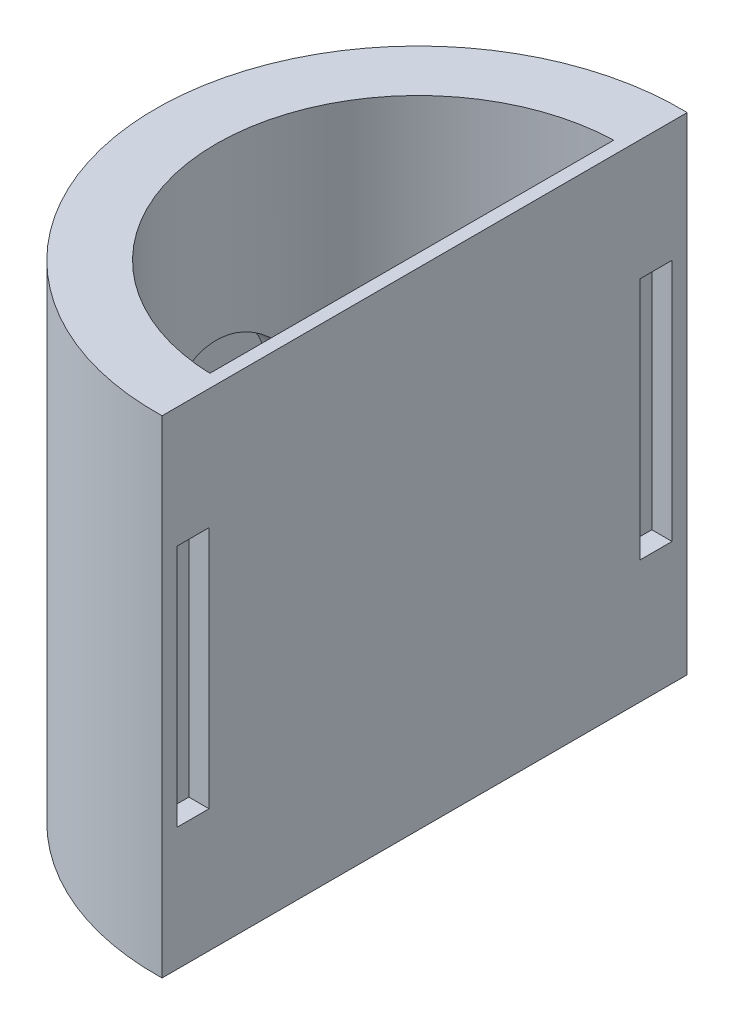
ISO-10303-21;
HEADER;
FILE_DESCRIPTION(('STEP AP214'),'2;1');
FILE_NAME('part.step','',(''),(''),'','','');
FILE_SCHEMA(('AUTOMOTIVE_DESIGN { 1 0 10303 214 1 1 1 1 }'));
ENDSEC;
DATA;
#1=APPLICATION_CONTEXT('core data for automotive mechanical design processes');
#2=APPLICATION_PROTOCOL_DEFINITION('international standard','automotive_design',2000,#1);
#3=PRODUCT_CONTEXT('',#1,'mechanical');
#4=PRODUCT('Part','Part','',(#3));
#5=PRODUCT_RELATED_PRODUCT_CATEGORY('part','',(#4));
#6=PRODUCT_DEFINITION_FORMATION('','',#4);
#7=PRODUCT_DEFINITION_CONTEXT('part definition',#1,'design');
#8=PRODUCT_DEFINITION('design','',#6,#7);
#9=PRODUCT_DEFINITION_SHAPE('','',#8);
#10=(LENGTH_UNIT() NAMED_UNIT(*) SI_UNIT(.MILLI.,.METRE.));
#11=(NAMED_UNIT(*) PLANE_ANGLE_UNIT() SI_UNIT($,.RADIAN.));
#12=(NAMED_UNIT(*) SI_UNIT($,.STERADIAN.) SOLID_ANGLE_UNIT());
#13=UNCERTAINTY_MEASURE_WITH_UNIT(LENGTH_MEASURE(1.E-05),#10,'distance_accuracy_value','');
#14=(GEOMETRIC_REPRESENTATION_CONTEXT(3) GLOBAL_UNCERTAINTY_ASSIGNED_CONTEXT((#13)) GLOBAL_UNIT_ASSIGNED_CONTEXT((#10,
#11,#12)) REPRESENTATION_CONTEXT('',''));
#15=CARTESIAN_POINT('',(0.,0.,0.));
#16=DIRECTION('',(0.,0.,1.));
#17=DIRECTION('',(1.,0.,0.));
#18=AXIS2_PLACEMENT_3D('',#15,#16,#17);
#19=CARTESIAN_POINT('',(3.175,0.,0.));
#20=DIRECTION('',(1.,0.,0.));
#21=DIRECTION('',(0.,0.,-1.));
#22=AXIS2_PLACEMENT_3D('',#19,#20,#21);
#23=PLANE('',#22);
#24=DIRECTION('',(0.,-1.,0.));
#25=VECTOR('',#24,1.);
#26=CARTESIAN_POINT('',(3.175,181.421684221425,122.458312978031));
#27=LINE('',#26,#25);
#28=CARTESIAN_POINT('',(3.175,181.421684221425,122.458312978031));
#29=VERTEX_POINT('',#28);
#30=CARTESIAN_POINT('',(3.175,60.9166842214253,122.458312978031));
#31=VERTEX_POINT('',#30);
#32=EDGE_CURVE('E78',#29,#31,#27,.T.);
#33=ORIENTED_EDGE('',*,*,#32,.F.);
#34=DIRECTION('',(0.,0.,1.));
#35=VECTOR('',#34,1.);
#36=CARTESIAN_POINT('',(3.175,181.421684221425,122.458312978031));
#37=LINE('',#36,#35);
#38=CARTESIAN_POINT('',(3.175,181.421684221425,106.709366457998));
#39=VERTEX_POINT('',#38);
#40=EDGE_CURVE('E199',#39,#29,#37,.T.);
#41=ORIENTED_EDGE('',*,*,#40,.F.);
#42=DIRECTION('',(0.,1.,0.));
#43=VECTOR('',#42,1.);
#44=CARTESIAN_POINT('',(3.175,181.421684221425,106.709366457998));
#45=LINE('',#44,#43);
#46=CARTESIAN_POINT('',(3.175,60.9166842214253,106.709366457998));
#47=VERTEX_POINT('',#46);
#48=EDGE_CURVE('E218',#47,#39,#45,.T.);
#49=ORIENTED_EDGE('',*,*,#48,.F.);
#50=DIRECTION('',(0.,0.,-1.));
#51=VECTOR('',#50,1.);
#52=CARTESIAN_POINT('',(3.175,60.9166842214253,122.458312978031));
#53=LINE('',#52,#51);
#54=EDGE_CURVE('E214',#31,#47,#53,.T.);
#55=ORIENTED_EDGE('',*,*,#54,.F.);
#56=EDGE_LOOP('',(#33,#41,#49,#55));
#57=FACE_BOUND('',#56,.T.);
#58=DIRECTION('',(0.,0.,-1.));
#59=VECTOR('',#58,1.);
#60=CARTESIAN_POINT('',(3.175,0.,0.));
#61=LINE('',#60,#59);
#62=CARTESIAN_POINT('',(3.175,0.,129.961222581969));
#63=VERTEX_POINT('',#62);
#64=CARTESIAN_POINT('',(3.175,0.,-129.961222581969));
#65=VERTEX_POINT('',#64);
#66=EDGE_CURVE('E249',#63,#65,#61,.T.);
#67=ORIENTED_EDGE('',*,*,#66,.T.);
#68=DIRECTION('',(0.,-1.,0.));
#69=VECTOR('',#68,1.);
#70=CARTESIAN_POINT('',(3.175,241.01,-129.961222581969));
#71=LINE('',#70,#69);
#72=CARTESIAN_POINT('',(3.175,241.01,-129.961222581969));
#73=VERTEX_POINT('',#72);
#74=EDGE_CURVE('E261',#65,#73,#71,.F.);
#75=ORIENTED_EDGE('',*,*,#74,.T.);
#76=DIRECTION('',(0.,0.,-1.));
#77=VECTOR('',#76,1.);
#78=CARTESIAN_POINT('',(3.175,241.01,0.));
#79=LINE('',#78,#77);
#80=CARTESIAN_POINT('',(3.175,241.01,129.961222581969));
#81=VERTEX_POINT('',#80);
#82=EDGE_CURVE('E253',#81,#73,#79,.T.);
#83=ORIENTED_EDGE('',*,*,#82,.F.);
#84=DIRECTION('',(0.,-1.,0.));
#85=VECTOR('',#84,1.);
#86=CARTESIAN_POINT('',(3.175,241.01,129.961222581969));
#87=LINE('',#86,#85);
#88=EDGE_CURVE('E257',#81,#63,#87,.T.);
#89=ORIENTED_EDGE('',*,*,#88,.T.);
#90=EDGE_LOOP('',(#67,#75,#83,#89));
#91=FACE_BOUND('',#90,.T.);
#92=DIRECTION('',(0.,0.,-1.));
#93=VECTOR('',#92,1.);
#94=CARTESIAN_POINT('',(3.175,181.421684221425,-122.458312978031));
#95=LINE('',#94,#93);
#96=CARTESIAN_POINT('',(3.175,181.421684221425,-106.709366457998));
#97=VERTEX_POINT('',#96);
#98=CARTESIAN_POINT('',(3.175,181.421684221425,-122.458312978031));
#99=VERTEX_POINT('',#98);
#100=EDGE_CURVE('E180',#97,#99,#95,.T.);
#101=ORIENTED_EDGE('',*,*,#100,.T.);
#102=DIRECTION('',(0.,-1.,0.));
#103=VECTOR('',#102,1.);
#104=CARTESIAN_POINT('',(3.175,181.421684221425,-122.458312978031));
#105=LINE('',#104,#103);
#106=CARTESIAN_POINT('',(3.175,60.9166842214253,-122.458312978031));
#107=VERTEX_POINT('',#106);
#108=EDGE_CURVE('E70',#99,#107,#105,.T.);
#109=ORIENTED_EDGE('',*,*,#108,.T.);
#110=DIRECTION('',(0.,0.,1.));
#111=VECTOR('',#110,1.);
#112=CARTESIAN_POINT('',(3.175,60.9166842214253,-122.458312978031));
#113=LINE('',#112,#111);
#114=CARTESIAN_POINT('',(3.175,60.9166842214253,-106.709366457998));
#115=VERTEX_POINT('',#114);
#116=EDGE_CURVE('E167',#107,#115,#113,.T.);
#117=ORIENTED_EDGE('',*,*,#116,.T.);
#118=DIRECTION('',(0.,1.,0.));
#119=VECTOR('',#118,1.);
#120=CARTESIAN_POINT('',(3.175,181.421684221425,-106.709366457998));
#121=LINE('',#120,#119);
#122=EDGE_CURVE('E171',#115,#97,#121,.T.);
#123=ORIENTED_EDGE('',*,*,#122,.T.);
#124=EDGE_LOOP('',(#101,#109,#117,#123));
#125=FACE_BOUND('',#124,.T.);
#126=ADVANCED_FACE('F48',(#57,#91,#125),#23,.T.);
#127=CARTESIAN_POINT('',(0.,0.,0.));
#128=DIRECTION('',(0.,1.,0.));
#129=DIRECTION('',(0.,0.,1.));
#130=AXIS2_PLACEMENT_3D('',#127,#128,#129);
#131=CYLINDRICAL_SURFACE('',#130,100.);
#132=DIRECTION('',(0.,1.,0.));
#133=VECTOR('',#132,1.);
#134=CARTESIAN_POINT('',(-3.175,0.,-99.9495841662185));
#135=LINE('',#134,#133);
#136=CARTESIAN_POINT('',(-3.175,241.01,-99.9495841662185));
#137=VERTEX_POINT('',#136);
#138=CARTESIAN_POINT('',(-3.175,0.,-99.9495841662185));
#139=VERTEX_POINT('',#138);
#140=EDGE_CURVE('E63',#137,#139,#135,.F.);
#141=ORIENTED_EDGE('',*,*,#140,.F.);
#142=CARTESIAN_POINT('',(0.,241.01,0.));
#143=DIRECTION('',(0.,1.,0.));
#144=DIRECTION('',(0.,0.,1.));
#145=AXIS2_PLACEMENT_3D('',#142,#143,#144);
#146=CIRCLE('',#145,100.);
#147=CARTESIAN_POINT('',(-3.175,241.01,99.9495841662185));
#148=VERTEX_POINT('',#147);
#149=EDGE_CURVE('E277',#137,#148,#146,.T.);
#150=ORIENTED_EDGE('',*,*,#149,.T.);
#151=DIRECTION('',(0.,1.,0.));
#152=VECTOR('',#151,1.);
#153=CARTESIAN_POINT('',(-3.175,0.,99.9495841662185));
#154=LINE('',#153,#152);
#155=CARTESIAN_POINT('',(-3.175,0.,99.9495841662185));
#156=VERTEX_POINT('',#155);
#157=EDGE_CURVE('E280',#156,#148,#154,.T.);
#158=ORIENTED_EDGE('',*,*,#157,.F.);
#159=CARTESIAN_POINT('',(0.,0.,0.));
#160=DIRECTION('',(0.,1.,0.));
#161=DIRECTION('',(0.,0.,1.));
#162=AXIS2_PLACEMENT_3D('',#159,#160,#161);
#163=CIRCLE('',#162,100.);
#164=EDGE_CURVE('E273',#139,#156,#163,.T.);
#165=ORIENTED_EDGE('',*,*,#164,.F.);
#166=EDGE_LOOP('',(#141,#150,#158,#165));
#167=FACE_BOUND('',#166,.T.);
#168=CARTESIAN_POINT('',(-93.674969975976,121.833368442851,35.));
#169=CARTESIAN_POINT('',(-93.6749683907048,120.883307341604,35.0000018813032));
#170=CARTESIAN_POINT('',(-93.6894623972338,119.933273473645,34.9612846876949));
#171=CARTESIAN_POINT('',(-93.7469563634782,118.040390622474,34.8068235152414));
#172=CARTESIAN_POINT('',(-93.7899552805107,117.097541377732,34.6910823538603));
#173=CARTESIAN_POINT('',(-93.903065448354,115.225914221406,34.3837319395093));
#174=CARTESIAN_POINT('',(-93.9731782306034,114.297137107721,34.1921184011204));
#175=CARTESIAN_POINT('',(-94.1382930475764,112.460264297402,33.7348598446921));
#176=CARTESIAN_POINT('',(-94.23329549605,111.552168944842,33.4692135959755));
#177=CARTESIAN_POINT('',(-94.4450444072971,109.764714436463,32.8669307925023));
#178=CARTESIAN_POINT('',(-94.5617429963634,108.885296928707,32.5304503250584));
#179=CARTESIAN_POINT('',(-94.813595358954,107.158645435537,31.7889186303744));
#180=CARTESIAN_POINT('',(-94.9487490413813,106.311411291288,31.3838677416052));
#181=CARTESIAN_POINT('',(-95.2337402865791,104.653960988935,30.5081410558545));
#182=CARTESIAN_POINT('',(-95.3835807174494,103.843752106782,30.0374524331996));
#183=CARTESIAN_POINT('',(-95.6938819700325,102.265072868206,29.0337186480598));
#184=CARTESIAN_POINT('',(-95.8543431115351,101.496603769839,28.5006716075903));
#185=CARTESIAN_POINT('',(-96.1881404919406,99.9763381986037,27.3534688997827));
#186=CARTESIAN_POINT('',(-96.3617348784469,99.2263801246834,26.7369508480327));
#187=CARTESIAN_POINT('',(-96.711156366134,97.7805096379847,25.4440674101182));
#188=CARTESIAN_POINT('',(-96.8869835180665,97.0845984562843,24.7677006614727));
#189=CARTESIAN_POINT('',(-97.2362087842107,95.7509099407631,23.3590716212607));
#190=CARTESIAN_POINT('',(-97.4096064756063,95.1131426223289,22.6267997396975));
#191=CARTESIAN_POINT('',(-97.7493638554733,93.8999237490472,21.1107847765045));
#192=CARTESIAN_POINT('',(-97.915723467792,93.3244728683654,20.3270411381789));
#193=CARTESIAN_POINT('',(-98.2417032769161,92.2239682625989,18.6891670146274));
#194=CARTESIAN_POINT('',(-98.4009852143806,91.7008748649289,17.8336500483562));
#195=CARTESIAN_POINT('',(-98.7029487975108,90.7289384944736,16.0785777910745));
#196=CARTESIAN_POINT('',(-98.845630026231,90.2800973864989,15.17902139477));
#197=CARTESIAN_POINT('',(-99.1102665535388,89.4606120090395,13.3422515327253));
#198=CARTESIAN_POINT('',(-99.2322266455765,89.0899496495506,12.4050468384155));
#199=CARTESIAN_POINT('',(-99.4518866289141,88.4301556691786,10.4996062337446));
#200=CARTESIAN_POINT('',(-99.5495876750388,88.1410201672113,9.531371802998));
#201=CARTESIAN_POINT('',(-99.7146153976494,87.656557991495,7.60860394732463));
#202=CARTESIAN_POINT('',(-99.7829563382131,87.4580805932989,6.65495093587366));
#203=CARTESIAN_POINT('',(-99.8925730173507,87.1411746283009,4.73289243253266));
#204=CARTESIAN_POINT('',(-99.933849381651,87.0227442108305,3.76448728223817));
#205=CARTESIAN_POINT('',(-99.9881519584664,86.8671582689629,1.82061615019731));
#206=CARTESIAN_POINT('',(-100.001185044203,86.8299829704817,0.84515194431699));
#207=CARTESIAN_POINT('',(-99.9986456029762,86.8372377818989,-1.10542315741886));
#208=CARTESIAN_POINT('',(-99.9830738149364,86.8816657838135,-2.08053406175009));
#209=CARTESIAN_POINT('',(-99.9250619574809,87.047973580907,-3.98073614119291));
#210=CARTESIAN_POINT('',(-99.883813082215,87.1664204432818,-4.90616664791338));
#211=CARTESIAN_POINT('',(-99.7766291739579,87.4764640294268,-6.74320235095382));
#212=CARTESIAN_POINT('',(-99.7106949822833,87.6680582602179,-7.65480801734563));
#213=CARTESIAN_POINT('',(-99.555835992112,88.1226860637964,-9.45804194425616));
#214=CARTESIAN_POINT('',(-99.4669103478439,88.3857222646905,-10.3496694685407));
#215=CARTESIAN_POINT('',(-99.2683207099901,88.9809990583689,-12.1071320934858));
#216=CARTESIAN_POINT('',(-99.1586562238314,89.313241294901,-12.9729665809644));
#217=CARTESIAN_POINT('',(-98.91968087661,90.0493149339479,-14.685169876658));
#218=CARTESIAN_POINT('',(-98.7901207488869,90.4540673564042,-15.531107692811));
#219=CARTESIAN_POINT('',(-98.5157311050347,91.3289141826864,-17.185872977805));
#220=CARTESIAN_POINT('',(-98.3709015331096,91.7990088252803,-17.9947003110258));
#221=CARTESIAN_POINT('',(-98.0695028123468,92.8013885835958,-19.5708096800676));
#222=CARTESIAN_POINT('',(-97.9129308265123,93.3336887457803,-20.3380815983832));
#223=CARTESIAN_POINT('',(-97.5918923252335,94.4569720823477,-21.826644469902));
#224=CARTESIAN_POINT('',(-97.4274255406861,95.0479572578091,-22.5479338537858));
#225=CARTESIAN_POINT('',(-97.0860021398422,96.3170159314171,-23.9765523757448));
#226=CARTESIAN_POINT('',(-96.9088389583178,96.9980096966506,-24.681240542801));
#227=CARTESIAN_POINT('',(-96.5549932989675,98.4167387153526,-26.0311406706492));
#228=CARTESIAN_POINT('',(-96.3783108378659,99.1544759174465,-26.6763505872255));
#229=CARTESIAN_POINT('',(-96.03026091635,100.682379786076,-27.9033298404313));
#230=CARTESIAN_POINT('',(-95.858894483544,101.472556497829,-28.485086965409));
#231=CARTESIAN_POINT('',(-95.5263674302192,103.100466343318,-29.5810952941705));
#232=CARTESIAN_POINT('',(-95.3652068013689,103.938199438231,-30.095346553063));
#233=CARTESIAN_POINT('',(-95.0551788275073,105.670888280209,-31.0608208936182));
#234=CARTESIAN_POINT('',(-94.9065707192869,106.566580604299,-31.5108072361844));
#235=CARTESIAN_POINT('',(-94.6295278131393,108.395929295353,-32.3332790454117));
#236=CARTESIAN_POINT('',(-94.5010933704207,109.329586330417,-32.705763147486));
#237=CARTESIAN_POINT('',(-94.2687094288898,111.227878624379,-33.369660052174));
#238=CARTESIAN_POINT('',(-94.1647504712296,112.192501751738,-33.6611041815776));
#239=CARTESIAN_POINT('',(-93.9848614272934,114.145748255268,-34.1601575474256));
#240=CARTESIAN_POINT('',(-93.9089297145813,115.134370235223,-34.3677716486373));
#241=CARTESIAN_POINT('',(-93.7907891777757,117.078683896938,-34.6888399638963));
#242=CARTESIAN_POINT('',(-93.7471064145673,118.033606137862,-34.806420286826));
#243=CARTESIAN_POINT('',(-93.6889872959384,119.950769847515,-34.962561177754));
#244=CARTESIAN_POINT('',(-93.6745499822641,120.913011075394,-35.0011243348224));
#245=CARTESIAN_POINT('',(-93.6754085666919,122.837202195164,-34.9988258916663));
#246=CARTESIAN_POINT('',(-93.6906990144966,123.799152108124,-34.9579788505335));
#247=CARTESIAN_POINT('',(-93.7504868443559,125.71550372859,-34.7973209047063));
#248=CARTESIAN_POINT('',(-93.7949837937796,126.669905547692,-34.6775111696729));
#249=CARTESIAN_POINT('',(-93.9094018828056,128.526695093164,-34.3664143885885));
#250=CARTESIAN_POINT('',(-93.9782550804257,129.429652872554,-34.1781215750619));
#251=CARTESIAN_POINT('',(-94.1394736138196,131.2158898914,-33.7315253902144));
#252=CARTESIAN_POINT('',(-94.2318381930416,132.099169763059,-33.4732242716113));
#253=CARTESIAN_POINT('',(-94.4374170974561,133.840597718408,-32.8887536080327));
#254=CARTESIAN_POINT('',(-94.5506342792405,134.698742340138,-32.562574763711));
#255=CARTESIAN_POINT('',(-94.7947453844466,136.384646419791,-31.8449341154622));
#256=CARTESIAN_POINT('',(-94.9256399422029,137.212404785979,-31.45346996872));
#257=CARTESIAN_POINT('',(-95.2063276758885,138.860594501364,-30.5935695268475));
#258=CARTESIAN_POINT('',(-95.3566128379531,139.679815079519,-30.1229649464179));
#259=CARTESIAN_POINT('',(-95.5902634098827,140.876787769611,-29.369552842092));
#260=CARTESIAN_POINT('',(-95.6695218521054,141.270489119308,-29.1104828497575));
#261=CARTESIAN_POINT('',(-95.8302800643499,142.046898883738,-28.5768282851195));
#262=CARTESIAN_POINT('',(-95.911780327091,142.429604843442,-28.3022402879737));
#263=CARTESIAN_POINT('',(-96.1588347184785,143.560368338596,-27.4558546337068));
#264=CARTESIAN_POINT('',(-96.3269476703569,144.29109794279,-26.8614186534395));
#265=CARTESIAN_POINT('',(-96.6656177819247,145.701984792879,-25.615906737544));
#266=CARTESIAN_POINT('',(-96.8361750067973,146.382140687085,-24.9648292890616));
#267=CARTESIAN_POINT('',(-97.0951861075063,147.37912364906,-23.9303244571422));
#268=CARTESIAN_POINT('',(-97.1843291939523,147.715680332945,-23.5659066975203));
#269=CARTESIAN_POINT('',(-97.3614646651763,148.373054876823,-22.8230369389898));
#270=CARTESIAN_POINT('',(-97.4494573123365,148.693876373162,-22.444588218423));
#271=CARTESIAN_POINT('',(-97.7108456008473,149.632115702614,-21.2888276194053));
#272=CARTESIAN_POINT('',(-97.8816634689758,150.225353628818,-20.491054348446));
#273=CARTESIAN_POINT('',(-98.2116019288438,151.342754002841,-18.8463485370161));
#274=CARTESIAN_POINT('',(-98.370722419429,151.866915853351,-17.9994155715453));
#275=CARTESIAN_POINT('',(-98.672864275434,152.842224798681,-16.2617131669822));
#276=CARTESIAN_POINT('',(-98.8158859999332,153.293373522142,-15.370944706268));
#277=CARTESIAN_POINT('',(-99.08103716349,154.116537126728,-13.5566862002379));
#278=CARTESIAN_POINT('',(-99.2032792857587,154.48898166825,-12.6334077101585));
#279=CARTESIAN_POINT('',(-99.4243594133226,155.154560650656,-10.7559305624173));
#280=CARTESIAN_POINT('',(-99.5231973604771,155.447694894518,-9.80173182795006));
#281=CARTESIAN_POINT('',(-99.6945600277768,155.951714009744,-7.86985953636772));
#282=CARTESIAN_POINT('',(-99.7670934998291,156.1626262394,-6.89219390269546));
#283=CARTESIAN_POINT('',(-99.8837372189403,156.50015550892,-4.92075633542619));
#284=CARTESIAN_POINT('',(-99.9278488443656,156.626776636633,-3.92698518529039));
#285=CARTESIAN_POINT('',(-99.9848248725698,156.790065198613,-1.98279522859265));
#286=CARTESIAN_POINT('',(-99.9991810246266,156.831028012741,-1.03277842873836));
#287=CARTESIAN_POINT('',(-100.000750633997,156.835513611628,0.867440731752363));
#288=CARTESIAN_POINT('',(-99.9879650819807,156.799039222838,1.81764308435035));
#289=CARTESIAN_POINT('',(-99.9356029050031,156.649020640948,3.71109668496341));
#290=CARTESIAN_POINT('',(-99.8960287797109,156.535483638636,4.65434857323269));
#291=CARTESIAN_POINT('',(-99.7911641313187,156.232447250394,6.52710872510079));
#292=CARTESIAN_POINT('',(-99.7258735698288,156.042947751067,7.45661696818074));
#293=CARTESIAN_POINT('',(-99.5727984433262,155.594081806542,9.27776790479684));
#294=CARTESIAN_POINT('',(-99.4854662981222,155.336115759736,10.1697946372074));
#295=CARTESIAN_POINT('',(-99.2899517214694,154.751000595399,11.9284675373511));
#296=CARTESIAN_POINT('',(-99.1817696800566,154.423852772031,12.7951141795166));
#297=CARTESIAN_POINT('',(-98.9472201449453,153.702922964992,14.4978041572701));
#298=CARTESIAN_POINT('',(-98.8208502153216,153.309132054489,15.333843374726));
#299=CARTESIAN_POINT('',(-98.5530159716327,152.457870962546,16.970288658659));
#300=CARTESIAN_POINT('',(-98.4115511465242,152.000398624988,17.7706935174208));
#301=CARTESIAN_POINT('',(-98.1111148063443,151.005689113966,19.3620779730725));
#302=CARTESIAN_POINT('',(-97.9516746414361,150.466029715295,20.1514607712964));
#303=CARTESIAN_POINT('',(-97.7061352707418,149.610399317769,21.2994017530762));
#304=CARTESIAN_POINT('',(-97.6232208263192,149.317481352151,21.6760465347708));
#305=CARTESIAN_POINT('',(-97.4557623169913,148.716613978087,22.4169272339069));
#306=CARTESIAN_POINT('',(-97.3712178824125,148.408661134951,22.7811602833383));
#307=CARTESIAN_POINT('',(-97.1159509575869,147.462970289998,23.8544072432622));
#308=CARTESIAN_POINT('',(-96.9435920361095,146.803390275011,24.5439819698691));
#309=CARTESIAN_POINT('',(-96.5989913088897,145.430120930148,25.8670131820176));
#310=CARTESIAN_POINT('',(-96.4267495050848,144.716430726055,26.5004687605266));
#311=CARTESIAN_POINT('',(-96.1680855059325,143.592083191806,27.4190923191649));
#312=CARTESIAN_POINT('',(-96.0799650598455,143.199493929999,27.7261083762469));
#313=CARTESIAN_POINT('',(-95.9056413760241,142.401394652527,28.323217413341));
#314=CARTESIAN_POINT('',(-95.8194376911978,141.9958877048,28.6133143659726));
#315=CARTESIAN_POINT('',(-95.5646072302144,140.760675230296,29.4576234433529));
#316=CARTESIAN_POINT('',(-95.3997479631386,139.912221826976,29.985899748164));
#317=CARTESIAN_POINT('',(-95.0851910776809,138.171255183482,30.9689031729684));
#318=CARTESIAN_POINT('',(-94.9354922522033,137.278745459564,31.4236361503101));
#319=CARTESIAN_POINT('',(-94.6559468898139,135.455392340892,32.2559226113073));
#320=CARTESIAN_POINT('',(-94.5260998046804,134.524550005623,32.6334782263753));
#321=CARTESIAN_POINT('',(-94.2918542495873,132.641546094299,33.3042214527754));
#322=CARTESIAN_POINT('',(-94.1871909824179,131.689732724426,33.5982933602775));
#323=CARTESIAN_POINT('',(-94.0050161067479,129.762020580729,34.104684350907));
#324=CARTESIAN_POINT('',(-93.9275043617096,128.78612192805,34.3170038451459));
#325=CARTESIAN_POINT('',(-93.8023729365003,126.818237443927,34.6575796587097));
#326=CARTESIAN_POINT('',(-93.7547418798324,125.826257882724,34.7858679721105));
#327=CARTESIAN_POINT('',(-93.6910419381582,123.833964716561,34.9570752480587));
#328=CARTESIAN_POINT('',(-93.6749716450474,122.833651485412,34.9999980192477));
#329=CARTESIAN_POINT('',(-93.674969975976,121.833368442851,35.));
#330=B_SPLINE_CURVE_WITH_KNOTS('',3,(#168,#169,#170,#171,#172,#173,#174,#175,#176,#177,#178,
#179,#180,#181,#182,#183,#184,#185,#186,#187,#188,#189,#190,#191,#192,#193,#194,#195,#196,#197,
#198,#199,#200,#201,#202,#203,#204,#205,#206,#207,#208,#209,#210,#211,#212,#213,#214,#215,#216,
#217,#218,#219,#220,#221,#222,#223,#224,#225,#226,#227,#228,#229,#230,#231,#232,#233,#234,#235,
#236,#237,#238,#239,#240,#241,#242,#243,#244,#245,#246,#247,#248,#249,#250,#251,#252,#253,#254,
#255,#256,#257,#258,#259,#260,#261,#262,#263,#264,#265,#266,#267,#268,#269,#270,#271,#272,#273,
#274,#275,#276,#277,#278,#279,#280,#281,#282,#283,#284,#285,#286,#287,#288,#289,#290,#291,#292,
#293,#294,#295,#296,#297,#298,#299,#300,#301,#302,#303,#304,#305,#306,#307,#308,#309,#310,#311,
#312,#313,#314,#315,#316,#317,#318,#319,#320,#321,#322,#323,#324,#325,#326,#327,#328,#329),
.UNSPECIFIED.,.T.,.F.,(4,2,2,2,2,2,2,2,2,2,2,2,2,2,2,2,2,2,2,2,2,2,2,2,2,2,2,2,2,2,2,2,2,2,2,2,
2,2,2,2,2,2,2,2,2,2,2,2,2,2,2,2,2,2,2,2,2,2,2,2,2,2,2,2,2,2,2,2,2,2,2,2,2,2,2,2,2,2,2,2,4),(0.,
2.84924226083804,5.69838030480754,8.54767929657796,11.397025656283,14.2401578348721,
17.0832759798695,19.9269504532485,22.7707105887131,25.726092878833,28.6815424668061,
31.6375001782923,34.5934898653851,37.6357268088226,40.6780401449845,43.7196487373737,
46.7611125096026,49.6868524128217,52.6125246712682,55.5374848646278,58.4623695012107,
61.2607515319765,64.059038197932,66.8574278172689,69.6558839101629,72.4927956294028,
75.3297177153192,78.1673274305871,81.0050339377062,83.989170789739,86.9734101657451,
89.9582228566101,92.9430331107869,95.9792012683357,99.0154228793653,102.050469172572,
105.085339312709,107.97105840419,110.856682940919,113.741778476197,116.626831276009,
119.398496890675,122.170073329638,124.942029728832,127.714085623302,130.580598802388,
132.014008308618,133.447735414951,136.315094821029,139.182530835806,140.694137430366,
142.205393035918,145.22770602261,148.250045141988,151.272316835402,154.277636924716,
157.282964479762,160.287291196318,163.291472201925,166.140992742674,168.990409277929,
171.839559967856,174.688714911053,177.483568939908,180.278370690902,183.073547101898,
185.86881817466,188.773562918653,190.226097256062,191.678964989106,194.584651210651,
197.490384387139,199.008319622599,200.525896998733,203.56083105269,206.595523270572,
209.630131667825,212.631282268407,215.632417776788,218.632409966044,221.632268305605),.UNSPECIFIED.);
#331=CARTESIAN_POINT('',(-93.674969975976,121.833368442851,35.));
#332=VERTEX_POINT('',#331);
#333=EDGE_CURVE('E53',#332,#332,#330,.T.);
#334=ORIENTED_EDGE('',*,*,#333,.F.);
#335=EDGE_LOOP('',(#334));
#336=FACE_BOUND('',#335,.T.);
#337=ADVANCED_FACE('F50',(#167,#336),#131,.F.);
#338=CARTESIAN_POINT('',(0.,241.01,0.));
#339=DIRECTION('',(0.,-1.,0.));
#340=DIRECTION('',(0.,0.,-1.));
#341=AXIS2_PLACEMENT_3D('',#338,#339,#340);
#342=CYLINDRICAL_SURFACE('',#341,130.);
#343=ORIENTED_EDGE('',*,*,#88,.F.);
#344=CARTESIAN_POINT('',(0.,241.01,0.));
#345=DIRECTION('',(0.,1.,0.));
#346=DIRECTION('',(0.,0.,1.));
#347=AXIS2_PLACEMENT_3D('',#344,#345,#346);
#348=CIRCLE('',#347,130.);
#349=EDGE_CURVE('E256',#73,#81,#348,.T.);
#350=ORIENTED_EDGE('',*,*,#349,.F.);
#351=ORIENTED_EDGE('',*,*,#74,.F.);
#352=CARTESIAN_POINT('',(0.,0.,0.));
#353=DIRECTION('',(0.,1.,0.));
#354=DIRECTION('',(0.,0.,1.));
#355=AXIS2_PLACEMENT_3D('',#352,#353,#354);
#356=CIRCLE('',#355,130.);
#357=EDGE_CURVE('E270',#65,#63,#356,.T.);
#358=ORIENTED_EDGE('',*,*,#357,.T.);
#359=EDGE_LOOP('',(#343,#350,#351,#358));
#360=FACE_BOUND('',#359,.T.);
#361=CARTESIAN_POINT('',(-125.199840255489,121.833368442851,35.));
#362=CARTESIAN_POINT('',(-125.199842516735,122.797103343891,34.9999966037626));
#363=CARTESIAN_POINT('',(-125.210998204615,123.7609027058,34.9601610806065));
#364=CARTESIAN_POINT('',(-125.255282954906,125.681472486194,34.8011605968556));
#365=CARTESIAN_POINT('',(-125.288413997359,126.638242263439,34.6819884878087));
#366=CARTESIAN_POINT('',(-125.375649657872,128.538177864483,34.3652938034911));
#367=CARTESIAN_POINT('',(-125.42976335603,129.481337615113,34.1677373070612));
#368=CARTESIAN_POINT('',(-125.557322911295,131.346910653116,33.6959682141241));
#369=CARTESIAN_POINT('',(-125.630768415915,132.269324318432,33.4217570153018));
#370=CARTESIAN_POINT('',(-125.794690788936,134.085769442522,32.799376047784));
#371=CARTESIAN_POINT('',(-125.885142841594,134.979840065202,32.4513139474903));
#372=CARTESIAN_POINT('',(-126.080530866036,136.735082624932,31.6836942234015));
#373=CARTESIAN_POINT('',(-126.185466889799,137.596254443901,31.2641363430242));
#374=CARTESIAN_POINT('',(-126.406867089651,139.280227767638,30.356581077352));
#375=CARTESIAN_POINT('',(-126.523331783068,140.103027548088,29.868580620406));
#376=CARTESIAN_POINT('',(-126.764579469522,141.705103998791,28.8275352076614));
#377=CARTESIAN_POINT('',(-126.88936260663,142.484379914811,28.274489125193));
#378=CARTESIAN_POINT('',(-127.146819621729,144.012045036645,27.093536873137));
#379=CARTESIAN_POINT('',(-127.279609076712,144.759308491007,26.4641991747339));
#380=CARTESIAN_POINT('',(-127.546695749415,146.198501879402,25.1454352811005));
#381=CARTESIAN_POINT('',(-127.680992988588,146.890431024966,24.4560082299385));
#382=CARTESIAN_POINT('',(-127.947430735682,148.214531094438,23.0214494190683));
#383=CARTESIAN_POINT('',(-128.079571022788,148.846695931394,22.2763119991087));
#384=CARTESIAN_POINT('',(-128.338082444663,150.046963824882,20.7351631005393));
#385=CARTESIAN_POINT('',(-128.464453548593,150.615066538988,19.939151350029));
#386=CARTESIAN_POINT('',(-128.70998194219,151.692017774136,18.287932097174));
#387=CARTESIAN_POINT('',(-128.828986959024,152.199741883747,17.4319679453442));
#388=CARTESIAN_POINT('',(-129.054112081498,153.141080084286,15.6785625435647));
#389=CARTESIAN_POINT('',(-129.160232003872,153.574693121163,14.7811207039258));
#390=CARTESIAN_POINT('',(-129.356539286755,154.364285343163,12.9511522379261));
#391=CARTESIAN_POINT('',(-129.446728764174,154.720274844729,12.0186302931748));
#392=CARTESIAN_POINT('',(-129.608581312528,155.351685321429,10.1251345420257));
#393=CARTESIAN_POINT('',(-129.680244886229,155.627108483043,9.16416150853806));
#394=CARTESIAN_POINT('',(-129.801518938219,156.08950558783,7.24360364185694));
#395=CARTESIAN_POINT('',(-129.851604832959,156.278392832075,6.28450929107983));
#396=CARTESIAN_POINT('',(-129.930694046223,156.575357365018,4.35302750325614));
#397=CARTESIAN_POINT('',(-129.959697661707,156.683435791968,3.38064025364643));
#398=CARTESIAN_POINT('',(-129.995794745433,156.817805692619,1.42996962961122));
#399=CARTESIAN_POINT('',(-130.002891456754,156.844109272204,0.451687149397495));
#400=CARTESIAN_POINT('',(-129.994980819561,156.814724225975,-1.50354825744126));
#401=CARTESIAN_POINT('',(-129.979973792375,156.759036792091,-2.48050120318751));
#402=CARTESIAN_POINT('',(-129.928952525818,156.568664703243,-4.40067887002619));
#403=CARTESIAN_POINT('',(-129.893489042379,156.436050660915,-5.34412441128564));
#404=CARTESIAN_POINT('',(-129.802948637615,156.0946081555,-7.21614056685747));
#405=CARTESIAN_POINT('',(-129.747872110869,155.885781225672,-8.14471148002685));
#406=CARTESIAN_POINT('',(-129.619573968008,155.393617825356,-9.98062754959341));
#407=CARTESIAN_POINT('',(-129.54635171872,155.110278754831,-10.8879719641067));
#408=CARTESIAN_POINT('',(-129.38369698946,154.471328410773,-12.6753443556488));
#409=CARTESIAN_POINT('',(-129.294264249504,154.115715978111,-13.5553718943049));
#410=CARTESIAN_POINT('',(-129.100554020244,153.330971690518,-15.2910831576304));
#411=CARTESIAN_POINT('',(-128.996136346433,152.901136742204,-16.1464332527309));
#412=CARTESIAN_POINT('',(-128.775895228526,151.973608298298,-17.8179560060523));
#413=CARTESIAN_POINT('',(-128.660071744861,151.475914567293,-18.6341285283464));
#414=CARTESIAN_POINT('',(-128.42002239884,150.416029956113,-20.2223406316894));
#415=CARTESIAN_POINT('',(-128.295795153108,149.853828446401,-20.9943729078539));
#416=CARTESIAN_POINT('',(-128.042181853499,148.668705360271,-22.4894349310118));
#417=CARTESIAN_POINT('',(-127.912795688932,148.045782480604,-23.2124636256883));
#418=CARTESIAN_POINT('',(-127.648146237792,146.72276875974,-24.6269077936353));
#419=CARTESIAN_POINT('',(-127.512825763905,146.02087269058,-25.3166251429348));
#420=CARTESIAN_POINT('',(-127.244037002284,144.561310760827,-26.6347066353934));
#421=CARTESIAN_POINT('',(-127.110568754405,143.803643702398,-27.2630694601201));
#422=CARTESIAN_POINT('',(-126.849235882697,142.237405809686,-28.4542315283773));
#423=CARTESIAN_POINT('',(-126.72137165653,141.428831372901,-29.0170261238678));
#424=CARTESIAN_POINT('',(-126.4749264893,139.766100176875,-30.0730289214228));
#425=CARTESIAN_POINT('',(-126.356345505657,138.911943626733,-30.5662374426609));
#426=CARTESIAN_POINT('',(-126.131224361305,137.158079605703,-31.4823489523632));
#427=CARTESIAN_POINT('',(-126.024766565067,136.258114457384,-31.9047792627682));
#428=CARTESIAN_POINT('',(-125.828025705673,134.423969447046,-32.6720821154161));
#429=CARTESIAN_POINT('',(-125.737742769478,133.489789316532,-33.0169540488838));
#430=CARTESIAN_POINT('',(-125.576195096774,131.594122124641,-33.6261598798153));
#431=CARTESIAN_POINT('',(-125.504926408356,130.632640783563,-33.8905105143924));
#432=CARTESIAN_POINT('',(-125.383668530303,128.689353054579,-34.3364118092644));
#433=CARTESIAN_POINT('',(-125.333678676132,127.707547302406,-34.5179650553253));
#434=CARTESIAN_POINT('',(-125.257780152331,125.761237148765,-34.7923572876348));
#435=CARTESIAN_POINT('',(-125.231184727845,124.797115917692,-34.8877286718502));
#436=CARTESIAN_POINT('',(-125.200351921325,122.863935480614,-34.9982173514851));
#437=CARTESIAN_POINT('',(-125.196114087508,121.894876374787,-35.0133362685842));
#438=CARTESIAN_POINT('',(-125.210128004039,119.959106139629,-34.9631878062364));
#439=CARTESIAN_POINT('',(-125.228377513146,118.992394785927,-34.897928437841));
#440=CARTESIAN_POINT('',(-125.286793369358,117.068367985336,-34.6876243570508));
#441=CARTESIAN_POINT('',(-125.326959592108,116.111052485166,-34.5425800973556));
#442=CARTESIAN_POINT('',(-125.426969254213,114.231526864642,-34.1776293559847));
#443=CARTESIAN_POINT('',(-125.486408819054,113.308996773056,-33.9592563958226));
#444=CARTESIAN_POINT('',(-125.623416944531,111.485946477928,-33.4488692642836));
#445=CARTESIAN_POINT('',(-125.700985203579,110.585425908513,-33.1568563179689));
#446=CARTESIAN_POINT('',(-125.872042594703,108.81222950242,-32.5014385455561));
#447=CARTESIAN_POINT('',(-125.965533302569,107.939556431873,-32.1380266528026));
#448=CARTESIAN_POINT('',(-126.165821633638,106.227686526599,-31.3425204308504));
#449=CARTESIAN_POINT('',(-126.272619563135,105.388490463006,-30.9104245206776));
#450=CARTESIAN_POINT('',(-126.499117835738,103.730430852203,-29.9701871894372));
#451=CARTESIAN_POINT('',(-126.619053133132,102.912440459608,-29.4605624582217));
#452=CARTESIAN_POINT('',(-126.866459380566,101.322012009305,-28.3762333181236));
#453=CARTESIAN_POINT('',(-126.993930420621,100.549574495961,-27.8015281317608));
#454=CARTESIAN_POINT('',(-127.252959419549,99.0549224007552,-26.590741605556));
#455=CARTESIAN_POINT('',(-127.384518055804,98.3327162079703,-25.9546500557959));
#456=CARTESIAN_POINT('',(-127.64817740132,96.9431563319878,-24.6252298162749));
#457=CARTESIAN_POINT('',(-127.78027811959,96.2758035642357,-23.9319001716578));
#458=CARTESIAN_POINT('',(-128.045382259458,94.9813077237793,-22.4710302334532));
#459=CARTESIAN_POINT('',(-128.178296859051,94.3559372680049,-21.7019017291623));
#460=CARTESIAN_POINT('',(-128.437264654678,93.1721639822693,-20.1126123657492));
#461=CARTESIAN_POINT('',(-128.563317701576,92.6137626075753,-19.2924503982356));
#462=CARTESIAN_POINT('',(-128.805020914551,91.5680037283407,-17.6065777557978));
#463=CARTESIAN_POINT('',(-128.920671387894,91.0806441251481,-16.7408684274212));
#464=CARTESIAN_POINT('',(-129.138304619339,90.1806835567451,-14.9697749294534));
#465=CARTESIAN_POINT('',(-129.240287603816,89.7680813532921,-14.0643914173132));
#466=CARTESIAN_POINT('',(-129.42696116751,89.0238099185064,-12.227327135777));
#467=CARTESIAN_POINT('',(-129.511777778993,88.6915470545764,-11.2958997953343));
#468=CARTESIAN_POINT('',(-129.66267270605,88.1066936298373,-9.40685885607885));
#469=CARTESIAN_POINT('',(-129.728751054432,87.8541029295414,-8.44924530311512));
#470=CARTESIAN_POINT('',(-129.840255264354,87.4308451470754,-6.51507757943512));
#471=CARTESIAN_POINT('',(-129.885685013583,87.2601626430073,-5.53852701028485));
#472=CARTESIAN_POINT('',(-129.954587297535,87.0022003552222,-3.57371120497009));
#473=CARTESIAN_POINT('',(-129.978060402628,86.9149184049993,-2.58544627378616));
#474=CARTESIAN_POINT('',(-130.001985953008,86.8259683999275,-0.635803123169358));
#475=CARTESIAN_POINT('',(-130.00313548372,86.8217078682474,0.325449211084965));
#476=CARTESIAN_POINT('',(-129.984159778914,86.8922328047248,2.24482354140954));
#477=CARTESIAN_POINT('',(-129.964035016719,86.9670165142614,3.20294560664806));
#478=CARTESIAN_POINT('',(-129.903065484364,87.1949728881522,5.1090985035814));
#479=CARTESIAN_POINT('',(-129.862221616643,87.3481421383572,6.05712977295375));
#480=CARTESIAN_POINT('',(-129.760930431926,87.7315618647893,7.93640160291922));
#481=CARTESIAN_POINT('',(-129.700483027781,87.9618126836905,8.86764208884776));
#482=CARTESIAN_POINT('',(-129.562120865158,88.49556635748,10.7002465251989));
#483=CARTESIAN_POINT('',(-129.484334578502,88.7985316432583,11.6017769274548));
#484=CARTESIAN_POINT('',(-129.313106616016,89.4761906777517,13.3759017311195));
#485=CARTESIAN_POINT('',(-129.219665070812,89.8508838279783,14.2484963738932));
#486=CARTESIAN_POINT('',(-129.019551641898,90.669253405072,15.9592336358182));
#487=CARTESIAN_POINT('',(-128.912878336724,91.1129372447798,16.7973725405546));
#488=CARTESIAN_POINT('',(-128.689060361623,92.066124688568,18.4338803304538));
#489=CARTESIAN_POINT('',(-128.571915454868,92.5756297814006,19.2322483155075));
#490=CARTESIAN_POINT('',(-128.326876631567,93.6716890029501,20.8053724906754));
#491=CARTESIAN_POINT('',(-128.198777522253,94.259956154863,21.5789035808102));
#492=CARTESIAN_POINT('',(-127.938140582838,95.4983322615489,23.0739707234909));
#493=CARTESIAN_POINT('',(-127.805602672471,96.1484423349932,23.7955058350709));
#494=CARTESIAN_POINT('',(-127.539627036987,97.5064326042557,25.1821795401041));
#495=CARTESIAN_POINT('',(-127.406189093635,98.2143273097369,25.8473038828529));
#496=CARTESIAN_POINT('',(-127.142072967241,99.6832308832303,27.1166676618937));
#497=CARTESIAN_POINT('',(-127.011394795068,100.444239960409,27.7209068583948));
#498=CARTESIAN_POINT('',(-126.753518727178,102.032308371056,28.8774044713977));
#499=CARTESIAN_POINT('',(-126.626465966191,102.860470853796,29.4281817374147));
#500=CARTESIAN_POINT('',(-126.382740397976,104.561838805034,30.457889222328));
#501=CARTESIAN_POINT('',(-126.266068059301,105.435046303977,30.9368161986995));
#502=CARTESIAN_POINT('',(-126.046682802428,107.220011366216,31.8188668310053));
#503=CARTESIAN_POINT('',(-125.943962007626,108.131746793411,32.2220333086737));
#504=CARTESIAN_POINT('',(-125.755582405329,109.987766020925,32.9495812356885));
#505=CARTESIAN_POINT('',(-125.669921320812,110.932045457711,33.2739732006328));
#506=CARTESIAN_POINT('',(-125.530460522972,112.693362124623,33.7959189593738));
#507=CARTESIAN_POINT('',(-125.473757405647,113.506642713269,34.0054547186449));
#508=CARTESIAN_POINT('',(-125.375586920604,115.146981604805,34.3656389618756));
#509=CARTESIAN_POINT('',(-125.334117680968,115.974038201856,34.5162946810746));
#510=CARTESIAN_POINT('',(-125.26737628325,117.637412655447,34.7577352500281));
#511=CARTESIAN_POINT('',(-125.242102516084,118.473729583538,34.8485260476196));
#512=CARTESIAN_POINT('',(-125.208332610179,120.151137117133,34.9696631659499));
#513=CARTESIAN_POINT('',(-125.199838281891,120.992228227941,35.0000029642092));
#514=CARTESIAN_POINT('',(-125.199840255489,121.833368442851,35.));
#515=B_SPLINE_CURVE_WITH_KNOTS('',3,(#361,#362,#363,#364,#365,#366,#367,#368,#369,#370,#371,
#372,#373,#374,#375,#376,#377,#378,#379,#380,#381,#382,#383,#384,#385,#386,#387,#388,#389,#390,
#391,#392,#393,#394,#395,#396,#397,#398,#399,#400,#401,#402,#403,#404,#405,#406,#407,#408,#409,
#410,#411,#412,#413,#414,#415,#416,#417,#418,#419,#420,#421,#422,#423,#424,#425,#426,#427,#428,
#429,#430,#431,#432,#433,#434,#435,#436,#437,#438,#439,#440,#441,#442,#443,#444,#445,#446,#447,
#448,#449,#450,#451,#452,#453,#454,#455,#456,#457,#458,#459,#460,#461,#462,#463,#464,#465,#466,
#467,#468,#469,#470,#471,#472,#473,#474,#475,#476,#477,#478,#479,#480,#481,#482,#483,#484,#485,
#486,#487,#488,#489,#490,#491,#492,#493,#494,#495,#496,#497,#498,#499,#500,#501,#502,#503,#504,
#505,#506,#507,#508,#509,#510,#511,#512,#513,#514),.UNSPECIFIED.,.T.,.F.,(4,2,2,2,2,2,2,2,2,2,2,
2,2,2,2,2,2,2,2,2,2,2,2,2,2,2,2,2,2,2,2,2,2,2,2,2,2,2,2,2,2,2,2,2,2,2,2,2,2,2,2,2,2,2,2,2,2,2,2,
2,2,2,2,2,2,2,2,2,2,2,2,2,2,2,2,2,4),(0.,2.89043238969846,5.78112525083564,8.67307043775145,
11.5649628977715,14.4526678413032,17.3403831483718,20.2282280954178,23.1161230708388,
26.0705745821378,29.0250681844494,31.9798623764334,34.9346723617846,37.9379353794735,
40.9412411077612,43.9441474424698,46.9469722741186,49.8797534928737,52.8124934004395,
55.7447991268041,58.6770622256982,61.5338371028266,64.3905545102345,67.2473716135816,
70.1042345385524,72.9898150022804,75.8754054768281,78.7614721211685,81.6476007221061,
84.6240758912141,87.6006150070017,90.5773649972561,93.5541013334725,96.5499866991037,
99.5458955793699,102.54118130603,105.536373483385,108.440385763918,111.3443393622,
114.248003555962,117.151651274498,119.998009011977,122.844319401061,125.690911643549,
128.537569418608,131.447826643846,134.358118639985,137.268895519414,140.179720966767,
143.176622922467,146.173589990355,149.170468506593,152.167297379566,155.141255050069,
158.115207513859,161.088599813885,164.061914871655,166.942229301154,169.822479649142,
172.702604556042,175.582742267009,178.442210012796,181.301653900582,184.161405239537,
187.021221271995,189.958490886544,192.895813643225,195.833876241,198.771950409623,
201.776342171465,204.780869477456,207.783693407255,210.786116269922,213.309151505043,
215.831876609468,218.354351032538,220.877097608207),.UNSPECIFIED.);
#516=CARTESIAN_POINT('',(-125.199840255489,121.833368442851,35.));
#517=VERTEX_POINT('',#516);
#518=EDGE_CURVE('E12',#517,#517,#515,.T.);
#519=ORIENTED_EDGE('',*,*,#518,.F.);
#520=EDGE_LOOP('',(#519));
#521=FACE_BOUND('',#520,.T.);
#522=ADVANCED_FACE('F291',(#360,#521),#342,.T.);
#523=CARTESIAN_POINT('',(0.,241.01,0.));
#524=DIRECTION('',(0.,1.,0.));
#525=DIRECTION('',(0.,0.,1.));
#526=AXIS2_PLACEMENT_3D('',#523,#524,#525);
#527=PLANE('',#526);
#528=ORIENTED_EDGE('',*,*,#149,.F.);
#529=DIRECTION('',(0.,0.,1.));
#530=VECTOR('',#529,1.);
#531=CARTESIAN_POINT('',(-3.175,241.01,106.678671161408));
#532=LINE('',#531,#530);
#533=EDGE_CURVE('E245',#137,#148,#532,.T.);
#534=ORIENTED_EDGE('',*,*,#533,.T.);
#535=EDGE_LOOP('',(#528,#534));
#536=FACE_BOUND('',#535,.T.);
#537=ORIENTED_EDGE('',*,*,#349,.T.);
#538=ORIENTED_EDGE('',*,*,#82,.T.);
#539=EDGE_LOOP('',(#537,#538));
#540=FACE_BOUND('',#539,.T.);
#541=ADVANCED_FACE('F379',(#536,#540),#527,.T.);
#542=CARTESIAN_POINT('',(0.,0.,0.));
#543=DIRECTION('',(0.,1.,0.));
#544=DIRECTION('',(0.,0.,1.));
#545=AXIS2_PLACEMENT_3D('',#542,#543,#544);
#546=PLANE('',#545);
#547=DIRECTION('',(0.,0.,1.));
#548=VECTOR('',#547,1.);
#549=CARTESIAN_POINT('',(-3.175,0.,0.773064833453416));
#550=LINE('',#549,#548);
#551=EDGE_CURVE('E244',#139,#156,#550,.T.);
#552=ORIENTED_EDGE('',*,*,#551,.F.);
#553=ORIENTED_EDGE('',*,*,#164,.T.);
#554=EDGE_LOOP('',(#552,#553));
#555=FACE_BOUND('',#554,.T.);
#556=ORIENTED_EDGE('',*,*,#357,.F.);
#557=ORIENTED_EDGE('',*,*,#66,.F.);
#558=EDGE_LOOP('',(#556,#557));
#559=FACE_BOUND('',#558,.T.);
#560=ADVANCED_FACE('F304',(#555,#559),#546,.F.);
#561=CARTESIAN_POINT('',(-3.175,241.01,0.773064833453416));
#562=DIRECTION('',(1.,0.,0.));
#563=DIRECTION('',(0.,0.,-1.));
#564=AXIS2_PLACEMENT_3D('',#561,#562,#563);
#565=PLANE('',#564);
#566=ORIENTED_EDGE('',*,*,#533,.F.);
#567=ORIENTED_EDGE('',*,*,#140,.T.);
#568=ORIENTED_EDGE('',*,*,#551,.T.);
#569=ORIENTED_EDGE('',*,*,#157,.T.);
#570=EDGE_LOOP('',(#566,#567,#568,#569));
#571=FACE_BOUND('',#570,.T.);
#572=ADVANCED_FACE('F301',(#571),#565,.F.);
#573=CARTESIAN_POINT('',(-120.,121.833368442851,0.));
#574=DIRECTION('',(-1.,0.,0.));
#575=DIRECTION('',(0.,0.,1.));
#576=AXIS2_PLACEMENT_3D('',#573,#574,#575);
#577=CYLINDRICAL_SURFACE('',#576,35.);
#578=CARTESIAN_POINT('',(-120.,121.833368442851,0.));
#579=DIRECTION('',(1.,0.,0.));
#580=DIRECTION('',(0.,0.,-1.));
#581=AXIS2_PLACEMENT_3D('',#578,#579,#580);
#582=CIRCLE('',#581,35.);
#583=CARTESIAN_POINT('',(-120.,121.833368442851,-35.));
#584=VERTEX_POINT('',#583);
#585=EDGE_CURVE('E240',#584,#584,#582,.T.);
#586=ORIENTED_EDGE('',*,*,#585,.T.);
#587=EDGE_LOOP('',(#586));
#588=FACE_BOUND('',#587,.T.);
#589=ORIENTED_EDGE('',*,*,#518,.T.);
#590=EDGE_LOOP('',(#589));
#591=FACE_BOUND('',#590,.T.);
#592=ADVANCED_FACE('F295',(#588,#591),#577,.F.);
#593=CARTESIAN_POINT('',(-120.,121.833368442851,0.));
#594=DIRECTION('',(1.,0.,0.));
#595=DIRECTION('',(0.,0.,-1.));
#596=AXIS2_PLACEMENT_3D('',#593,#594,#595);
#597=PLANE('',#596);
#598=ORIENTED_EDGE('',*,*,#585,.F.);
#599=EDGE_LOOP('',(#598));
#600=FACE_BOUND('',#599,.T.);
#601=ADVANCED_FACE('F300',(#600),#597,.F.);
#602=CARTESIAN_POINT('',(-90.,121.833368442851,0.));
#603=DIRECTION('',(-1.,0.,0.));
#604=DIRECTION('',(0.,0.,1.));
#605=AXIS2_PLACEMENT_3D('',#602,#603,#604);
#606=CYLINDRICAL_SURFACE('',#605,35.);
#607=CARTESIAN_POINT('',(-110.,121.833368442851,0.));
#608=DIRECTION('',(1.,0.,0.));
#609=DIRECTION('',(0.,0.,-1.));
#610=AXIS2_PLACEMENT_3D('',#607,#608,#609);
#611=CIRCLE('',#610,35.);
#612=CARTESIAN_POINT('',(-110.,121.833368442851,-35.));
#613=VERTEX_POINT('',#612);
#614=EDGE_CURVE('E228',#613,#613,#611,.T.);
#615=ORIENTED_EDGE('',*,*,#614,.F.);
#616=EDGE_LOOP('',(#615));
#617=FACE_BOUND('',#616,.T.);
#618=ORIENTED_EDGE('',*,*,#333,.T.);
#619=EDGE_LOOP('',(#618));
#620=FACE_BOUND('',#619,.T.);
#621=ADVANCED_FACE('F357',(#617,#620),#606,.F.);
#622=CARTESIAN_POINT('',(-110.,121.833368442851,0.));
#623=DIRECTION('',(1.,0.,0.));
#624=DIRECTION('',(0.,0.,-1.));
#625=AXIS2_PLACEMENT_3D('',#622,#623,#624);
#626=PLANE('',#625);
#627=ORIENTED_EDGE('',*,*,#614,.T.);
#628=EDGE_LOOP('',(#627));
#629=FACE_BOUND('',#628,.T.);
#630=ADVANCED_FACE('F355',(#629),#626,.T.);
#631=CARTESIAN_POINT('',(-6.825,181.421684221425,122.458312978031));
#632=DIRECTION('',(0.,0.,1.));
#633=DIRECTION('',(1.,0.,0.));
#634=AXIS2_PLACEMENT_3D('',#631,#632,#633);
#635=PLANE('',#634);
#636=ORIENTED_EDGE('',*,*,#32,.T.);
#637=DIRECTION('',(1.,0.,0.));
#638=VECTOR('',#637,1.);
#639=CARTESIAN_POINT('',(-6.825,60.9166842214253,122.458312978031));
#640=LINE('',#639,#638);
#641=CARTESIAN_POINT('',(-6.825,60.9166842214253,122.458312978031));
#642=VERTEX_POINT('',#641);
#643=EDGE_CURVE('E211',#642,#31,#640,.T.);
#644=ORIENTED_EDGE('',*,*,#643,.F.);
#645=DIRECTION('',(0.,-1.,0.));
#646=VECTOR('',#645,1.);
#647=CARTESIAN_POINT('',(-6.825,181.421684221425,122.458312978031));
#648=LINE('',#647,#646);
#649=CARTESIAN_POINT('',(-6.825,181.421684221425,122.458312978031));
#650=VERTEX_POINT('',#649);
#651=EDGE_CURVE('E194',#650,#642,#648,.T.);
#652=ORIENTED_EDGE('',*,*,#651,.F.);
#653=DIRECTION('',(1.,0.,0.));
#654=VECTOR('',#653,1.);
#655=CARTESIAN_POINT('',(-6.825,181.421684221425,122.458312978031));
#656=LINE('',#655,#654);
#657=EDGE_CURVE('E225',#650,#29,#656,.T.);
#658=ORIENTED_EDGE('',*,*,#657,.T.);
#659=EDGE_LOOP('',(#636,#644,#652,#658));
#660=FACE_BOUND('',#659,.T.);
#661=ADVANCED_FACE('F345',(#660),#635,.F.);
#662=CARTESIAN_POINT('',(-6.825,181.421684221425,122.458312978031));
#663=DIRECTION('',(0.,1.,0.));
#664=DIRECTION('',(0.,0.,1.));
#665=AXIS2_PLACEMENT_3D('',#662,#663,#664);
#666=PLANE('',#665);
#667=ORIENTED_EDGE('',*,*,#40,.T.);
#668=ORIENTED_EDGE('',*,*,#657,.F.);
#669=DIRECTION('',(0.,0.,1.));
#670=VECTOR('',#669,1.);
#671=CARTESIAN_POINT('',(-6.825,181.421684221425,122.458312978031));
#672=LINE('',#671,#670);
#673=CARTESIAN_POINT('',(-6.825,181.421684221425,106.709366457998));
#674=VERTEX_POINT('',#673);
#675=EDGE_CURVE('E207',#674,#650,#672,.T.);
#676=ORIENTED_EDGE('',*,*,#675,.F.);
#677=DIRECTION('',(1.,0.,0.));
#678=VECTOR('',#677,1.);
#679=CARTESIAN_POINT('',(-6.825,181.421684221425,106.709366457998));
#680=LINE('',#679,#678);
#681=EDGE_CURVE('E229',#674,#39,#680,.T.);
#682=ORIENTED_EDGE('',*,*,#681,.T.);
#683=EDGE_LOOP('',(#667,#668,#676,#682));
#684=FACE_BOUND('',#683,.T.);
#685=ADVANCED_FACE('F341',(#684),#666,.F.);
#686=CARTESIAN_POINT('',(-6.825,181.421684221425,106.709366457998));
#687=DIRECTION('',(0.,0.,-1.));
#688=DIRECTION('',(-1.,0.,0.));
#689=AXIS2_PLACEMENT_3D('',#686,#687,#688);
#690=PLANE('',#689);
#691=ORIENTED_EDGE('',*,*,#48,.T.);
#692=ORIENTED_EDGE('',*,*,#681,.F.);
#693=DIRECTION('',(0.,1.,0.));
#694=VECTOR('',#693,1.);
#695=CARTESIAN_POINT('',(-6.825,181.421684221425,106.709366457998));
#696=LINE('',#695,#694);
#697=CARTESIAN_POINT('',(-6.825,60.9166842214253,106.709366457998));
#698=VERTEX_POINT('',#697);
#699=EDGE_CURVE('E203',#698,#674,#696,.T.);
#700=ORIENTED_EDGE('',*,*,#699,.F.);
#701=DIRECTION('',(1.,0.,0.));
#702=VECTOR('',#701,1.);
#703=CARTESIAN_POINT('',(-6.825,60.9166842214253,106.709366457998));
#704=LINE('',#703,#702);
#705=EDGE_CURVE('E232',#698,#47,#704,.T.);
#706=ORIENTED_EDGE('',*,*,#705,.T.);
#707=EDGE_LOOP('',(#691,#692,#700,#706));
#708=FACE_BOUND('',#707,.T.);
#709=ADVANCED_FACE('F344',(#708),#690,.F.);
#710=CARTESIAN_POINT('',(-6.825,60.9166842214253,122.458312978031));
#711=DIRECTION('',(0.,-1.,0.));
#712=DIRECTION('',(0.,0.,-1.));
#713=AXIS2_PLACEMENT_3D('',#710,#711,#712);
#714=PLANE('',#713);
#715=ORIENTED_EDGE('',*,*,#54,.T.);
#716=ORIENTED_EDGE('',*,*,#705,.F.);
#717=DIRECTION('',(0.,0.,-1.));
#718=VECTOR('',#717,1.);
#719=CARTESIAN_POINT('',(-6.825,60.9166842214253,122.458312978031));
#720=LINE('',#719,#718);
#721=EDGE_CURVE('E198',#642,#698,#720,.T.);
#722=ORIENTED_EDGE('',*,*,#721,.F.);
#723=ORIENTED_EDGE('',*,*,#643,.T.);
#724=EDGE_LOOP('',(#715,#716,#722,#723));
#725=FACE_BOUND('',#724,.T.);
#726=ADVANCED_FACE('F339',(#725),#714,.F.);
#727=CARTESIAN_POINT('',(-6.825,0.,0.));
#728=DIRECTION('',(1.,0.,0.));
#729=DIRECTION('',(0.,0.,-1.));
#730=AXIS2_PLACEMENT_3D('',#727,#728,#729);
#731=PLANE('',#730);
#732=ORIENTED_EDGE('',*,*,#651,.T.);
#733=ORIENTED_EDGE('',*,*,#721,.T.);
#734=ORIENTED_EDGE('',*,*,#699,.T.);
#735=ORIENTED_EDGE('',*,*,#675,.T.);
#736=EDGE_LOOP('',(#732,#733,#734,#735));
#737=FACE_BOUND('',#736,.T.);
#738=ADVANCED_FACE('F332',(#737),#731,.T.);
#739=CARTESIAN_POINT('',(-6.825,181.421684221425,-122.458312978031));
#740=DIRECTION('',(0.,0.,1.));
#741=DIRECTION('',(1.,0.,0.));
#742=AXIS2_PLACEMENT_3D('',#739,#740,#741);
#743=PLANE('',#742);
#744=ORIENTED_EDGE('',*,*,#108,.F.);
#745=DIRECTION('',(1.,0.,0.));
#746=VECTOR('',#745,1.);
#747=CARTESIAN_POINT('',(-6.825,181.421684221425,-122.458312978031));
#748=LINE('',#747,#746);
#749=CARTESIAN_POINT('',(-6.825,181.421684221425,-122.458312978031));
#750=VERTEX_POINT('',#749);
#751=EDGE_CURVE('E149',#750,#99,#748,.T.);
#752=ORIENTED_EDGE('',*,*,#751,.F.);
#753=DIRECTION('',(0.,-1.,0.));
#754=VECTOR('',#753,1.);
#755=CARTESIAN_POINT('',(-6.825,181.421684221425,-122.458312978031));
#756=LINE('',#755,#754);
#757=CARTESIAN_POINT('',(-6.825,60.9166842214253,-122.458312978031));
#758=VERTEX_POINT('',#757);
#759=EDGE_CURVE('E157',#750,#758,#756,.T.);
#760=ORIENTED_EDGE('',*,*,#759,.T.);
#761=DIRECTION('',(1.,0.,0.));
#762=VECTOR('',#761,1.);
#763=CARTESIAN_POINT('',(-6.825,60.9166842214253,-122.458312978031));
#764=LINE('',#763,#762);
#765=EDGE_CURVE('E186',#758,#107,#764,.T.);
#766=ORIENTED_EDGE('',*,*,#765,.T.);
#767=EDGE_LOOP('',(#744,#752,#760,#766));
#768=FACE_BOUND('',#767,.T.);
#769=ADVANCED_FACE('F160',(#768),#743,.T.);
#770=CARTESIAN_POINT('',(-6.825,60.9166842214253,-122.458312978031));
#771=DIRECTION('',(0.,1.,0.));
#772=DIRECTION('',(0.,0.,1.));
#773=AXIS2_PLACEMENT_3D('',#770,#771,#772);
#774=PLANE('',#773);
#775=ORIENTED_EDGE('',*,*,#116,.F.);
#776=ORIENTED_EDGE('',*,*,#765,.F.);
#777=DIRECTION('',(0.,0.,1.));
#778=VECTOR('',#777,1.);
#779=CARTESIAN_POINT('',(-6.825,60.9166842214253,-122.458312978031));
#780=LINE('',#779,#778);
#781=CARTESIAN_POINT('',(-6.825,60.9166842214253,-106.709366457998));
#782=VERTEX_POINT('',#781);
#783=EDGE_CURVE('E163',#758,#782,#780,.T.);
#784=ORIENTED_EDGE('',*,*,#783,.T.);
#785=DIRECTION('',(1.,0.,0.));
#786=VECTOR('',#785,1.);
#787=CARTESIAN_POINT('',(-6.825,60.9166842214253,-106.709366457998));
#788=LINE('',#787,#786);
#789=EDGE_CURVE('E189',#782,#115,#788,.T.);
#790=ORIENTED_EDGE('',*,*,#789,.T.);
#791=EDGE_LOOP('',(#775,#776,#784,#790));
#792=FACE_BOUND('',#791,.T.);
#793=ADVANCED_FACE('F325',(#792),#774,.T.);
#794=CARTESIAN_POINT('',(-6.825,181.421684221425,-106.709366457998));
#795=DIRECTION('',(0.,0.,-1.));
#796=DIRECTION('',(-1.,0.,0.));
#797=AXIS2_PLACEMENT_3D('',#794,#795,#796);
#798=PLANE('',#797);
#799=ORIENTED_EDGE('',*,*,#122,.F.);
#800=ORIENTED_EDGE('',*,*,#789,.F.);
#801=DIRECTION('',(0.,1.,0.));
#802=VECTOR('',#801,1.);
#803=CARTESIAN_POINT('',(-6.825,181.421684221425,-106.709366457998));
#804=LINE('',#803,#802);
#805=CARTESIAN_POINT('',(-6.825,181.421684221425,-106.709366457998));
#806=VERTEX_POINT('',#805);
#807=EDGE_CURVE('E156',#782,#806,#804,.T.);
#808=ORIENTED_EDGE('',*,*,#807,.T.);
#809=DIRECTION('',(1.,0.,0.));
#810=VECTOR('',#809,1.);
#811=CARTESIAN_POINT('',(-6.825,181.421684221425,-106.709366457998));
#812=LINE('',#811,#810);
#813=EDGE_CURVE('E151',#806,#97,#812,.T.);
#814=ORIENTED_EDGE('',*,*,#813,.T.);
#815=EDGE_LOOP('',(#799,#800,#808,#814));
#816=FACE_BOUND('',#815,.T.);
#817=ADVANCED_FACE('F323',(#816),#798,.T.);
#818=CARTESIAN_POINT('',(-6.825,181.421684221425,-122.458312978031));
#819=DIRECTION('',(0.,-1.,0.));
#820=DIRECTION('',(0.,0.,-1.));
#821=AXIS2_PLACEMENT_3D('',#818,#819,#820);
#822=PLANE('',#821);
#823=ORIENTED_EDGE('',*,*,#100,.F.);
#824=ORIENTED_EDGE('',*,*,#813,.F.);
#825=DIRECTION('',(0.,0.,-1.));
#826=VECTOR('',#825,1.);
#827=CARTESIAN_POINT('',(-6.825,181.421684221425,-122.458312978031));
#828=LINE('',#827,#826);
#829=EDGE_CURVE('E146',#806,#750,#828,.T.);
#830=ORIENTED_EDGE('',*,*,#829,.T.);
#831=ORIENTED_EDGE('',*,*,#751,.T.);
#832=EDGE_LOOP('',(#823,#824,#830,#831));
#833=FACE_BOUND('',#832,.T.);
#834=ADVANCED_FACE('F148',(#833),#822,.T.);
#835=CARTESIAN_POINT('',(-6.825,0.,0.));
#836=DIRECTION('',(1.,0.,0.));
#837=DIRECTION('',(0.,0.,1.));
#838=AXIS2_PLACEMENT_3D('',#835,#836,#837);
#839=PLANE('',#838);
#840=ORIENTED_EDGE('',*,*,#759,.F.);
#841=ORIENTED_EDGE('',*,*,#829,.F.);
#842=ORIENTED_EDGE('',*,*,#807,.F.);
#843=ORIENTED_EDGE('',*,*,#783,.F.);
#844=EDGE_LOOP('',(#840,#841,#842,#843));
#845=FACE_BOUND('',#844,.T.);
#846=ADVANCED_FACE('F165',(#845),#839,.T.);
#847=CLOSED_SHELL('',(#126,#337,#522,#541,#560,#572,#592,#601,#621,#630,#661,#685,#709,#726,
#738,#769,#793,#817,#834,#846));
#848=MANIFOLD_SOLID_BREP('B2',#847);
#849=ADVANCED_BREP_SHAPE_REPRESENTATION('',(#18,#848),#14);
#850=SHAPE_DEFINITION_REPRESENTATION(#9,#849);
ENDSEC;
END-ISO-10303-21;
